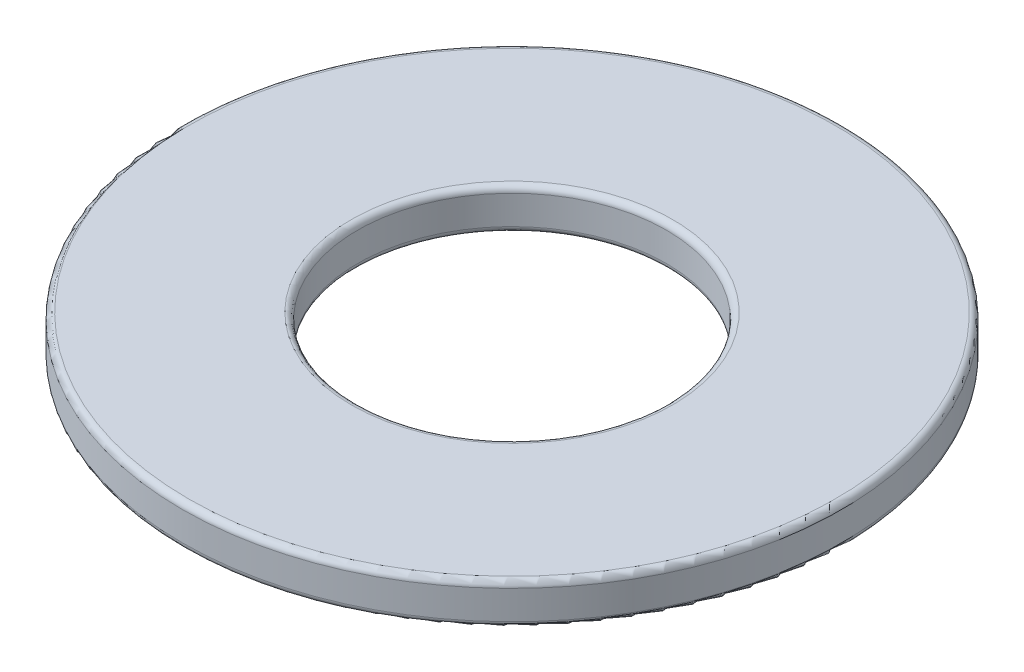
ISO-10303-21;
HEADER;
FILE_DESCRIPTION(('STEP AP214'),'2;1');
FILE_NAME('part.step','',(''),(''),'','','');
FILE_SCHEMA(('AUTOMOTIVE_DESIGN { 1 0 10303 214 1 1 1 1 }'));
ENDSEC;
DATA;
#1=APPLICATION_CONTEXT('core data for automotive mechanical design processes');
#2=APPLICATION_PROTOCOL_DEFINITION('international standard','automotive_design',2000,#1);
#3=PRODUCT_CONTEXT('',#1,'mechanical');
#4=PRODUCT('Part','Part','',(#3));
#5=PRODUCT_RELATED_PRODUCT_CATEGORY('part','',(#4));
#6=PRODUCT_DEFINITION_FORMATION('','',#4);
#7=PRODUCT_DEFINITION_CONTEXT('part definition',#1,'design');
#8=PRODUCT_DEFINITION('design','',#6,#7);
#9=PRODUCT_DEFINITION_SHAPE('','',#8);
#10=(LENGTH_UNIT() NAMED_UNIT(*) SI_UNIT(.MILLI.,.METRE.));
#11=(NAMED_UNIT(*) PLANE_ANGLE_UNIT() SI_UNIT($,.RADIAN.));
#12=(NAMED_UNIT(*) SI_UNIT($,.STERADIAN.) SOLID_ANGLE_UNIT());
#13=UNCERTAINTY_MEASURE_WITH_UNIT(LENGTH_MEASURE(1.E-05),#10,'distance_accuracy_value','');
#14=(GEOMETRIC_REPRESENTATION_CONTEXT(3) GLOBAL_UNCERTAINTY_ASSIGNED_CONTEXT((#13)) GLOBAL_UNIT_ASSIGNED_CONTEXT((#10,
#11,#12)) REPRESENTATION_CONTEXT('',''));
#15=CARTESIAN_POINT('',(0.,0.,0.));
#16=DIRECTION('',(0.,0.,1.));
#17=DIRECTION('',(1.,0.,0.));
#18=AXIS2_PLACEMENT_3D('',#15,#16,#17);
#19=CARTESIAN_POINT('',(0.,0.5,0.));
#20=DIRECTION('',(0.,1.,0.));
#21=DIRECTION('',(0.,0.,1.));
#22=AXIS2_PLACEMENT_3D('',#19,#20,#21);
#23=PLANE('',#22);
#24=CARTESIAN_POINT('',(0.,0.5,0.));
#25=DIRECTION('',(0.,1.,0.));
#26=DIRECTION('',(0.,0.,1.));
#27=AXIS2_PLACEMENT_3D('',#24,#25,#26);
#28=CIRCLE('',#27,3.9);
#29=CARTESIAN_POINT('',(0.,0.5,3.9));
#30=VERTEX_POINT('',#29);
#31=EDGE_CURVE('E42',#30,#30,#28,.F.);
#32=ORIENTED_EDGE('',*,*,#31,.T.);
#33=EDGE_LOOP('',(#32));
#34=FACE_BOUND('',#33,.T.);
#35=CARTESIAN_POINT('',(0.,0.5,0.));
#36=DIRECTION('',(0.,1.,0.));
#37=DIRECTION('',(0.,0.,1.));
#38=AXIS2_PLACEMENT_3D('',#35,#36,#37);
#39=CIRCLE('',#38,7.85);
#40=CARTESIAN_POINT('',(0.,0.5,7.85));
#41=VERTEX_POINT('',#40);
#42=EDGE_CURVE('E46',#41,#41,#39,.T.);
#43=ORIENTED_EDGE('',*,*,#42,.T.);
#44=EDGE_LOOP('',(#43));
#45=FACE_BOUND('',#44,.T.);
#46=ADVANCED_FACE('F31',(#34,#45),#23,.T.);
#47=CARTESIAN_POINT('',(0.,-0.5,0.));
#48=DIRECTION('',(0.,1.,0.));
#49=DIRECTION('',(0.,0.,1.));
#50=AXIS2_PLACEMENT_3D('',#47,#48,#49);
#51=PLANE('',#50);
#52=CARTESIAN_POINT('',(0.,-0.5,0.));
#53=DIRECTION('',(0.,1.,0.));
#54=DIRECTION('',(0.,0.,1.));
#55=AXIS2_PLACEMENT_3D('',#52,#53,#54);
#56=CIRCLE('',#55,3.9);
#57=CARTESIAN_POINT('',(0.,-0.5,3.9));
#58=VERTEX_POINT('',#57);
#59=EDGE_CURVE('E57',#58,#58,#56,.T.);
#60=ORIENTED_EDGE('',*,*,#59,.T.);
#61=EDGE_LOOP('',(#60));
#62=FACE_BOUND('',#61,.T.);
#63=CARTESIAN_POINT('',(0.,-0.5,0.));
#64=DIRECTION('',(0.,1.,0.));
#65=DIRECTION('',(0.,0.,1.));
#66=AXIS2_PLACEMENT_3D('',#63,#64,#65);
#67=CIRCLE('',#66,7.85);
#68=CARTESIAN_POINT('',(0.,-0.5,7.85));
#69=VERTEX_POINT('',#68);
#70=EDGE_CURVE('E60',#69,#69,#67,.F.);
#71=ORIENTED_EDGE('',*,*,#70,.T.);
#72=EDGE_LOOP('',(#71));
#73=FACE_BOUND('',#72,.T.);
#74=ADVANCED_FACE('F64',(#62,#73),#51,.F.);
#75=CARTESIAN_POINT('',(0.,0.5,0.));
#76=DIRECTION('',(0.,-1.,0.));
#77=DIRECTION('',(0.,0.,-1.));
#78=AXIS2_PLACEMENT_3D('',#75,#76,#77);
#79=CYLINDRICAL_SURFACE('',#78,8.);
#80=CARTESIAN_POINT('',(0.,-0.35,0.));
#81=DIRECTION('',(0.,1.,0.));
#82=DIRECTION('',(0.,0.,1.));
#83=AXIS2_PLACEMENT_3D('',#80,#81,#82);
#84=CIRCLE('',#83,8.);
#85=CARTESIAN_POINT('',(0.,-0.35,8.));
#86=VERTEX_POINT('',#85);
#87=EDGE_CURVE('E10',#86,#86,#84,.T.);
#88=ORIENTED_EDGE('',*,*,#87,.T.);
#89=EDGE_LOOP('',(#88));
#90=FACE_BOUND('',#89,.T.);
#91=CARTESIAN_POINT('',(0.,0.35,0.));
#92=DIRECTION('',(0.,1.,0.));
#93=DIRECTION('',(0.,0.,1.));
#94=AXIS2_PLACEMENT_3D('',#91,#92,#93);
#95=CIRCLE('',#94,8.);
#96=CARTESIAN_POINT('',(0.,0.35,8.));
#97=VERTEX_POINT('',#96);
#98=EDGE_CURVE('E38',#97,#97,#95,.F.);
#99=ORIENTED_EDGE('',*,*,#98,.T.);
#100=EDGE_LOOP('',(#99));
#101=FACE_BOUND('',#100,.T.);
#102=ADVANCED_FACE('F84',(#90,#101),#79,.T.);
#103=CARTESIAN_POINT('',(0.,0.5,0.));
#104=DIRECTION('',(0.,-1.,0.));
#105=DIRECTION('',(0.,0.,-1.));
#106=AXIS2_PLACEMENT_3D('',#103,#104,#105);
#107=CYLINDRICAL_SURFACE('',#106,3.75);
#108=CARTESIAN_POINT('',(0.,-0.35,0.));
#109=DIRECTION('',(0.,1.,0.));
#110=DIRECTION('',(0.,0.,1.));
#111=AXIS2_PLACEMENT_3D('',#108,#109,#110);
#112=CIRCLE('',#111,3.75);
#113=CARTESIAN_POINT('',(0.,-0.35,3.75));
#114=VERTEX_POINT('',#113);
#115=EDGE_CURVE('E51',#114,#114,#112,.F.);
#116=ORIENTED_EDGE('',*,*,#115,.T.);
#117=EDGE_LOOP('',(#116));
#118=FACE_BOUND('',#117,.T.);
#119=CARTESIAN_POINT('',(0.,0.35,0.));
#120=DIRECTION('',(0.,1.,0.));
#121=DIRECTION('',(0.,0.,1.));
#122=AXIS2_PLACEMENT_3D('',#119,#120,#121);
#123=CIRCLE('',#122,3.75);
#124=CARTESIAN_POINT('',(0.,0.35,3.75));
#125=VERTEX_POINT('',#124);
#126=EDGE_CURVE('E54',#125,#125,#123,.T.);
#127=ORIENTED_EDGE('',*,*,#126,.T.);
#128=EDGE_LOOP('',(#127));
#129=FACE_BOUND('',#128,.T.);
#130=ADVANCED_FACE('F89',(#118,#129),#107,.F.);
#131=CARTESIAN_POINT('',(0.,-0.35,0.));
#132=DIRECTION('',(0.,1.,0.));
#133=DIRECTION('',(0.,0.,1.));
#134=AXIS2_PLACEMENT_3D('',#131,#132,#133);
#135=TOROIDAL_SURFACE('',#134,3.9,0.15);
#136=ORIENTED_EDGE('',*,*,#115,.F.);
#137=EDGE_LOOP('',(#136));
#138=FACE_BOUND('',#137,.T.);
#139=ORIENTED_EDGE('',*,*,#59,.F.);
#140=EDGE_LOOP('',(#139));
#141=FACE_BOUND('',#140,.T.);
#142=ADVANCED_FACE('F75',(#138,#141),#135,.T.);
#143=CARTESIAN_POINT('',(0.,0.35,0.));
#144=DIRECTION('',(0.,1.,0.));
#145=DIRECTION('',(0.,0.,1.));
#146=AXIS2_PLACEMENT_3D('',#143,#144,#145);
#147=TOROIDAL_SURFACE('',#146,3.9,0.15);
#148=ORIENTED_EDGE('',*,*,#31,.F.);
#149=EDGE_LOOP('',(#148));
#150=FACE_BOUND('',#149,.T.);
#151=ORIENTED_EDGE('',*,*,#126,.F.);
#152=EDGE_LOOP('',(#151));
#153=FACE_BOUND('',#152,.T.);
#154=ADVANCED_FACE('F69',(#150,#153),#147,.T.);
#155=CARTESIAN_POINT('',(0.,-0.35,0.));
#156=DIRECTION('',(0.,1.,0.));
#157=DIRECTION('',(0.,0.,1.));
#158=AXIS2_PLACEMENT_3D('',#155,#156,#157);
#159=TOROIDAL_SURFACE('',#158,7.85,0.15);
#160=ORIENTED_EDGE('',*,*,#70,.F.);
#161=EDGE_LOOP('',(#160));
#162=FACE_BOUND('',#161,.T.);
#163=ORIENTED_EDGE('',*,*,#87,.F.);
#164=EDGE_LOOP('',(#163));
#165=FACE_BOUND('',#164,.T.);
#166=ADVANCED_FACE('F66',(#162,#165),#159,.T.);
#167=CARTESIAN_POINT('',(0.,0.35,0.));
#168=DIRECTION('',(0.,1.,0.));
#169=DIRECTION('',(0.,0.,1.));
#170=AXIS2_PLACEMENT_3D('',#167,#168,#169);
#171=TOROIDAL_SURFACE('',#170,7.85,0.15);
#172=ORIENTED_EDGE('',*,*,#98,.F.);
#173=EDGE_LOOP('',(#172));
#174=FACE_BOUND('',#173,.T.);
#175=ORIENTED_EDGE('',*,*,#42,.F.);
#176=EDGE_LOOP('',(#175));
#177=FACE_BOUND('',#176,.T.);
#178=ADVANCED_FACE('F33',(#174,#177),#171,.T.);
#179=CLOSED_SHELL('',(#46,#74,#102,#130,#142,#154,#166,#178));
#180=MANIFOLD_SOLID_BREP('B2',#179);
#181=ADVANCED_BREP_SHAPE_REPRESENTATION('',(#18,#180),#14);
#182=SHAPE_DEFINITION_REPRESENTATION(#9,#181);
ENDSEC;
END-ISO-10303-21;
